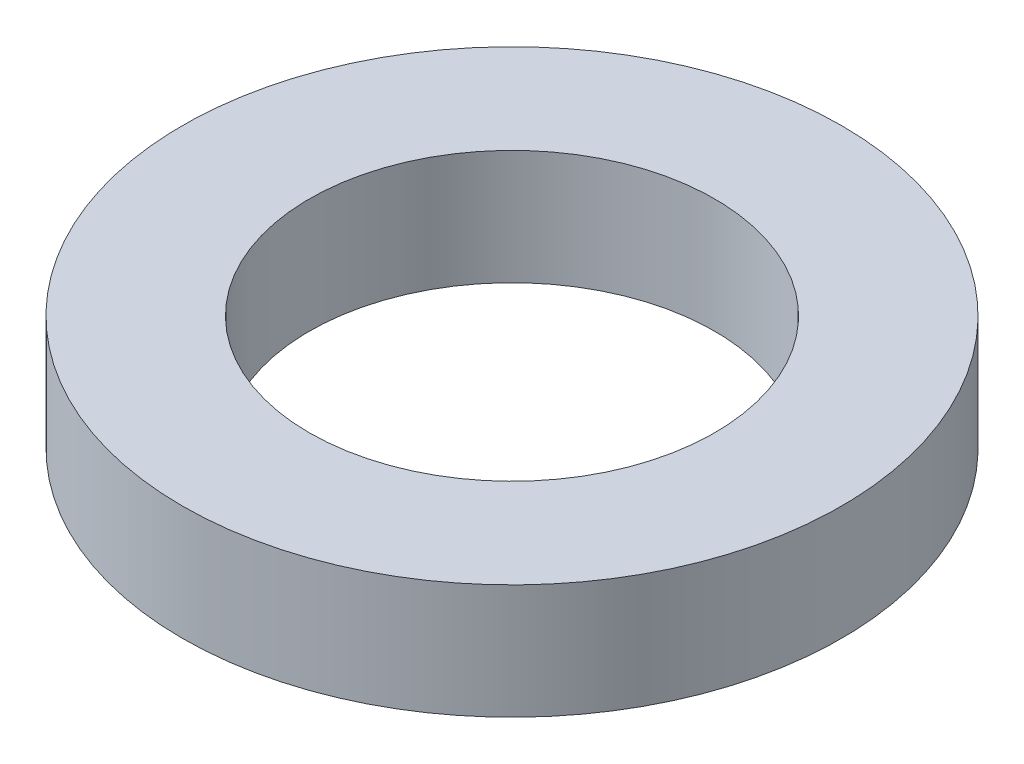
ISO-10303-21;
HEADER;
FILE_DESCRIPTION(('STEP AP214'),'2;1');
FILE_NAME('part.step','',(''),(''),'','','');
FILE_SCHEMA(('AUTOMOTIVE_DESIGN { 1 0 10303 214 1 1 1 1 }'));
ENDSEC;
DATA;
#1=APPLICATION_CONTEXT('core data for automotive mechanical design processes');
#2=APPLICATION_PROTOCOL_DEFINITION('international standard','automotive_design',2000,#1);
#3=PRODUCT_CONTEXT('',#1,'mechanical');
#4=PRODUCT('Part','Part','',(#3));
#5=PRODUCT_RELATED_PRODUCT_CATEGORY('part','',(#4));
#6=PRODUCT_DEFINITION_FORMATION('','',#4);
#7=PRODUCT_DEFINITION_CONTEXT('part definition',#1,'design');
#8=PRODUCT_DEFINITION('design','',#6,#7);
#9=PRODUCT_DEFINITION_SHAPE('','',#8);
#10=(LENGTH_UNIT() NAMED_UNIT(*) SI_UNIT(.MILLI.,.METRE.));
#11=(NAMED_UNIT(*) PLANE_ANGLE_UNIT() SI_UNIT($,.RADIAN.));
#12=(NAMED_UNIT(*) SI_UNIT($,.STERADIAN.) SOLID_ANGLE_UNIT());
#13=UNCERTAINTY_MEASURE_WITH_UNIT(LENGTH_MEASURE(1.E-05),#10,'distance_accuracy_value','');
#14=(GEOMETRIC_REPRESENTATION_CONTEXT(3) GLOBAL_UNCERTAINTY_ASSIGNED_CONTEXT((#13)) GLOBAL_UNIT_ASSIGNED_CONTEXT((#10,
#11,#12)) REPRESENTATION_CONTEXT('',''));
#15=CARTESIAN_POINT('',(0.,0.,0.));
#16=DIRECTION('',(0.,0.,1.));
#17=DIRECTION('',(1.,0.,0.));
#18=AXIS2_PLACEMENT_3D('',#15,#16,#17);
#19=CARTESIAN_POINT('',(0.,0.7112,0.));
#20=DIRECTION('',(0.,-1.,0.));
#21=DIRECTION('',(0.,0.,-1.));
#22=AXIS2_PLACEMENT_3D('',#19,#20,#21);
#23=CYLINDRICAL_SURFACE('',#22,2.0447);
#24=CARTESIAN_POINT('',(0.,0.7112,0.));
#25=DIRECTION('',(0.,1.,0.));
#26=DIRECTION('',(0.,0.,1.));
#27=AXIS2_PLACEMENT_3D('',#24,#25,#26);
#28=CIRCLE('',#27,2.0447);
#29=CARTESIAN_POINT('',(0.,0.7112,2.0447));
#30=VERTEX_POINT('',#29);
#31=EDGE_CURVE('E10',#30,#30,#28,.T.);
#32=ORIENTED_EDGE('',*,*,#31,.F.);
#33=EDGE_LOOP('',(#32));
#34=FACE_BOUND('',#33,.T.);
#35=CARTESIAN_POINT('',(0.,0.,0.));
#36=DIRECTION('',(0.,1.,0.));
#37=DIRECTION('',(0.,0.,1.));
#38=AXIS2_PLACEMENT_3D('',#35,#36,#37);
#39=CIRCLE('',#38,2.0447);
#40=CARTESIAN_POINT('',(0.,0.,2.0447));
#41=VERTEX_POINT('',#40);
#42=EDGE_CURVE('E31',#41,#41,#39,.T.);
#43=ORIENTED_EDGE('',*,*,#42,.T.);
#44=EDGE_LOOP('',(#43));
#45=FACE_BOUND('',#44,.T.);
#46=ADVANCED_FACE('F28',(#34,#45),#23,.T.);
#47=CARTESIAN_POINT('',(0.,0.7112,0.));
#48=DIRECTION('',(0.,1.,0.));
#49=DIRECTION('',(0.,0.,1.));
#50=AXIS2_PLACEMENT_3D('',#47,#48,#49);
#51=PLANE('',#50);
#52=CARTESIAN_POINT('',(0.,0.7112,0.));
#53=DIRECTION('',(0.,1.,0.));
#54=DIRECTION('',(0.,0.,1.));
#55=AXIS2_PLACEMENT_3D('',#52,#53,#54);
#56=CIRCLE('',#55,1.2573);
#57=CARTESIAN_POINT('',(0.,0.7112,1.2573));
#58=VERTEX_POINT('',#57);
#59=EDGE_CURVE('E40',#58,#58,#56,.T.);
#60=ORIENTED_EDGE('',*,*,#59,.F.);
#61=EDGE_LOOP('',(#60));
#62=FACE_BOUND('',#61,.T.);
#63=ORIENTED_EDGE('',*,*,#31,.T.);
#64=EDGE_LOOP('',(#63));
#65=FACE_BOUND('',#64,.T.);
#66=ADVANCED_FACE('F55',(#62,#65),#51,.T.);
#67=CARTESIAN_POINT('',(0.,0.,0.));
#68=DIRECTION('',(0.,1.,0.));
#69=DIRECTION('',(0.,0.,1.));
#70=AXIS2_PLACEMENT_3D('',#67,#68,#69);
#71=PLANE('',#70);
#72=CARTESIAN_POINT('',(0.,0.,0.));
#73=DIRECTION('',(0.,1.,0.));
#74=DIRECTION('',(0.,0.,1.));
#75=AXIS2_PLACEMENT_3D('',#72,#73,#74);
#76=CIRCLE('',#75,1.2573);
#77=CARTESIAN_POINT('',(0.,0.,1.2573));
#78=VERTEX_POINT('',#77);
#79=EDGE_CURVE('E38',#78,#78,#76,.T.);
#80=ORIENTED_EDGE('',*,*,#79,.T.);
#81=EDGE_LOOP('',(#80));
#82=FACE_BOUND('',#81,.T.);
#83=ORIENTED_EDGE('',*,*,#42,.F.);
#84=EDGE_LOOP('',(#83));
#85=FACE_BOUND('',#84,.T.);
#86=ADVANCED_FACE('F46',(#82,#85),#71,.F.);
#87=CARTESIAN_POINT('',(0.,0.,0.));
#88=DIRECTION('',(0.,1.,0.));
#89=DIRECTION('',(0.,0.,1.));
#90=AXIS2_PLACEMENT_3D('',#87,#88,#89);
#91=CYLINDRICAL_SURFACE('',#90,1.2573);
#92=ORIENTED_EDGE('',*,*,#79,.F.);
#93=EDGE_LOOP('',(#92));
#94=FACE_BOUND('',#93,.T.);
#95=ORIENTED_EDGE('',*,*,#59,.T.);
#96=EDGE_LOOP('',(#95));
#97=FACE_BOUND('',#96,.T.);
#98=ADVANCED_FACE('F49',(#94,#97),#91,.F.);
#99=CLOSED_SHELL('',(#46,#66,#86,#98));
#100=MANIFOLD_SOLID_BREP('B2',#99);
#101=ADVANCED_BREP_SHAPE_REPRESENTATION('',(#18,#100),#14);
#102=SHAPE_DEFINITION_REPRESENTATION(#9,#101);
ENDSEC;
END-ISO-10303-21;
